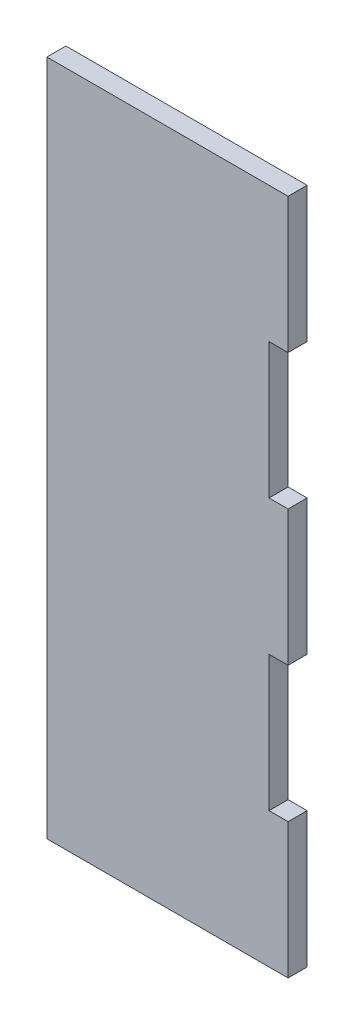
ISO-10303-21;
HEADER;
FILE_DESCRIPTION(('STEP AP214'),'2;1');
FILE_NAME('part.step','',(''),(''),'','','');
FILE_SCHEMA(('AUTOMOTIVE_DESIGN { 1 0 10303 214 1 1 1 1 }'));
ENDSEC;
DATA;
#1=APPLICATION_CONTEXT('core data for automotive mechanical design processes');
#2=APPLICATION_PROTOCOL_DEFINITION('international standard','automotive_design',2000,#1);
#3=PRODUCT_CONTEXT('',#1,'mechanical');
#4=PRODUCT('Part','Part','',(#3));
#5=PRODUCT_RELATED_PRODUCT_CATEGORY('part','',(#4));
#6=PRODUCT_DEFINITION_FORMATION('','',#4);
#7=PRODUCT_DEFINITION_CONTEXT('part definition',#1,'design');
#8=PRODUCT_DEFINITION('design','',#6,#7);
#9=PRODUCT_DEFINITION_SHAPE('','',#8);
#10=(LENGTH_UNIT() NAMED_UNIT(*) SI_UNIT(.MILLI.,.METRE.));
#11=(NAMED_UNIT(*) PLANE_ANGLE_UNIT() SI_UNIT($,.RADIAN.));
#12=(NAMED_UNIT(*) SI_UNIT($,.STERADIAN.) SOLID_ANGLE_UNIT());
#13=UNCERTAINTY_MEASURE_WITH_UNIT(LENGTH_MEASURE(1.E-05),#10,'distance_accuracy_value','');
#14=(GEOMETRIC_REPRESENTATION_CONTEXT(3) GLOBAL_UNCERTAINTY_ASSIGNED_CONTEXT((#13)) GLOBAL_UNIT_ASSIGNED_CONTEXT((#10,
#11,#12)) REPRESENTATION_CONTEXT('',''));
#15=CARTESIAN_POINT('',(0.,0.,0.));
#16=DIRECTION('',(0.,0.,1.));
#17=DIRECTION('',(1.,0.,0.));
#18=AXIS2_PLACEMENT_3D('',#15,#16,#17);
#19=CARTESIAN_POINT('',(0.,0.,9.));
#20=DIRECTION('',(0.,1.,0.));
#21=DIRECTION('',(0.,0.,1.));
#22=AXIS2_PLACEMENT_3D('',#19,#20,#21);
#23=PLANE('',#22);
#24=DIRECTION('',(1.,0.,0.));
#25=VECTOR('',#24,1.);
#26=CARTESIAN_POINT('',(0.,0.,0.));
#27=LINE('',#26,#25);
#28=CARTESIAN_POINT('',(0.,0.,0.));
#29=VERTEX_POINT('',#28);
#30=CARTESIAN_POINT('',(114.,0.,0.));
#31=VERTEX_POINT('',#30);
#32=EDGE_CURVE('E245',#29,#31,#27,.T.);
#33=ORIENTED_EDGE('',*,*,#32,.T.);
#34=DIRECTION('',(0.,0.,-1.));
#35=VECTOR('',#34,1.);
#36=CARTESIAN_POINT('',(114.,0.,9.));
#37=LINE('',#36,#35);
#38=CARTESIAN_POINT('',(114.,0.,9.));
#39=VERTEX_POINT('',#38);
#40=EDGE_CURVE('E12',#39,#31,#37,.T.);
#41=ORIENTED_EDGE('',*,*,#40,.F.);
#42=DIRECTION('',(1.,0.,0.));
#43=VECTOR('',#42,1.);
#44=CARTESIAN_POINT('',(0.,0.,9.));
#45=LINE('',#44,#43);
#46=CARTESIAN_POINT('',(0.,0.,9.));
#47=VERTEX_POINT('',#46);
#48=EDGE_CURVE('E200',#47,#39,#45,.T.);
#49=ORIENTED_EDGE('',*,*,#48,.F.);
#50=DIRECTION('',(0.,0.,-1.));
#51=VECTOR('',#50,1.);
#52=CARTESIAN_POINT('',(0.,0.,9.));
#53=LINE('',#52,#51);
#54=EDGE_CURVE('E162',#47,#29,#53,.T.);
#55=ORIENTED_EDGE('',*,*,#54,.T.);
#56=EDGE_LOOP('',(#33,#41,#49,#55));
#57=FACE_BOUND('',#56,.T.);
#58=ADVANCED_FACE('F46',(#57),#23,.F.);
#59=CARTESIAN_POINT('',(114.,0.,9.));
#60=DIRECTION('',(-1.,0.,0.));
#61=DIRECTION('',(0.,0.,1.));
#62=AXIS2_PLACEMENT_3D('',#59,#60,#61);
#63=PLANE('',#62);
#64=DIRECTION('',(0.,1.,0.));
#65=VECTOR('',#64,1.);
#66=CARTESIAN_POINT('',(114.,0.,0.));
#67=LINE('',#66,#65);
#68=CARTESIAN_POINT('',(114.,64.,0.));
#69=VERTEX_POINT('',#68);
#70=EDGE_CURVE('E239',#31,#69,#67,.T.);
#71=ORIENTED_EDGE('',*,*,#70,.T.);
#72=DIRECTION('',(0.,0.,-1.));
#73=VECTOR('',#72,1.);
#74=CARTESIAN_POINT('',(114.,64.,9.));
#75=LINE('',#74,#73);
#76=CARTESIAN_POINT('',(114.,64.,9.));
#77=VERTEX_POINT('',#76);
#78=EDGE_CURVE('E54',#77,#69,#75,.T.);
#79=ORIENTED_EDGE('',*,*,#78,.F.);
#80=DIRECTION('',(0.,1.,0.));
#81=VECTOR('',#80,1.);
#82=CARTESIAN_POINT('',(114.,0.,9.));
#83=LINE('',#82,#81);
#84=EDGE_CURVE('E117',#39,#77,#83,.T.);
#85=ORIENTED_EDGE('',*,*,#84,.F.);
#86=ORIENTED_EDGE('',*,*,#40,.T.);
#87=EDGE_LOOP('',(#71,#79,#85,#86));
#88=FACE_BOUND('',#87,.T.);
#89=ADVANCED_FACE('F274',(#88),#63,.F.);
#90=CARTESIAN_POINT('',(114.,64.,9.));
#91=DIRECTION('',(0.,-1.,0.));
#92=DIRECTION('',(0.,0.,-1.));
#93=AXIS2_PLACEMENT_3D('',#90,#91,#92);
#94=PLANE('',#93);
#95=DIRECTION('',(-1.,0.,0.));
#96=VECTOR('',#95,1.);
#97=CARTESIAN_POINT('',(114.,64.,0.));
#98=LINE('',#97,#96);
#99=CARTESIAN_POINT('',(105.,64.,0.));
#100=VERTEX_POINT('',#99);
#101=EDGE_CURVE('E234',#69,#100,#98,.T.);
#102=ORIENTED_EDGE('',*,*,#101,.T.);
#103=DIRECTION('',(0.,0.,-1.));
#104=VECTOR('',#103,1.);
#105=CARTESIAN_POINT('',(105.,64.,9.));
#106=LINE('',#105,#104);
#107=CARTESIAN_POINT('',(105.,64.,9.));
#108=VERTEX_POINT('',#107);
#109=EDGE_CURVE('E226',#108,#100,#106,.T.);
#110=ORIENTED_EDGE('',*,*,#109,.F.);
#111=DIRECTION('',(-1.,0.,0.));
#112=VECTOR('',#111,1.);
#113=CARTESIAN_POINT('',(114.,64.,9.));
#114=LINE('',#113,#112);
#115=EDGE_CURVE('E193',#77,#108,#114,.T.);
#116=ORIENTED_EDGE('',*,*,#115,.F.);
#117=ORIENTED_EDGE('',*,*,#78,.T.);
#118=EDGE_LOOP('',(#102,#110,#116,#117));
#119=FACE_BOUND('',#118,.T.);
#120=ADVANCED_FACE('F232',(#119),#94,.F.);
#121=CARTESIAN_POINT('',(105.,128.,9.));
#122=DIRECTION('',(-1.,0.,0.));
#123=DIRECTION('',(0.,0.,1.));
#124=AXIS2_PLACEMENT_3D('',#121,#122,#123);
#125=PLANE('',#124);
#126=DIRECTION('',(0.,1.,0.));
#127=VECTOR('',#126,1.);
#128=CARTESIAN_POINT('',(105.,128.,0.));
#129=LINE('',#128,#127);
#130=CARTESIAN_POINT('',(105.,128.,0.));
#131=VERTEX_POINT('',#130);
#132=EDGE_CURVE('E241',#100,#131,#129,.T.);
#133=ORIENTED_EDGE('',*,*,#132,.T.);
#134=DIRECTION('',(0.,0.,-1.));
#135=VECTOR('',#134,1.);
#136=CARTESIAN_POINT('',(105.,128.,9.));
#137=LINE('',#136,#135);
#138=CARTESIAN_POINT('',(105.,128.,9.));
#139=VERTEX_POINT('',#138);
#140=EDGE_CURVE('E223',#139,#131,#137,.T.);
#141=ORIENTED_EDGE('',*,*,#140,.F.);
#142=DIRECTION('',(0.,1.,0.));
#143=VECTOR('',#142,1.);
#144=CARTESIAN_POINT('',(105.,128.,9.));
#145=LINE('',#144,#143);
#146=EDGE_CURVE('E190',#108,#139,#145,.T.);
#147=ORIENTED_EDGE('',*,*,#146,.F.);
#148=ORIENTED_EDGE('',*,*,#109,.T.);
#149=EDGE_LOOP('',(#133,#141,#147,#148));
#150=FACE_BOUND('',#149,.T.);
#151=ADVANCED_FACE('F282',(#150),#125,.F.);
#152=CARTESIAN_POINT('',(114.,128.,9.));
#153=DIRECTION('',(0.,1.,0.));
#154=DIRECTION('',(0.,0.,1.));
#155=AXIS2_PLACEMENT_3D('',#152,#153,#154);
#156=PLANE('',#155);
#157=DIRECTION('',(1.,0.,0.));
#158=VECTOR('',#157,1.);
#159=CARTESIAN_POINT('',(114.,128.,0.));
#160=LINE('',#159,#158);
#161=CARTESIAN_POINT('',(114.,128.,0.));
#162=VERTEX_POINT('',#161);
#163=EDGE_CURVE('E243',#131,#162,#160,.T.);
#164=ORIENTED_EDGE('',*,*,#163,.T.);
#165=DIRECTION('',(0.,0.,-1.));
#166=VECTOR('',#165,1.);
#167=CARTESIAN_POINT('',(114.,128.,9.));
#168=LINE('',#167,#166);
#169=CARTESIAN_POINT('',(114.,128.,9.));
#170=VERTEX_POINT('',#169);
#171=EDGE_CURVE('E220',#170,#162,#168,.T.);
#172=ORIENTED_EDGE('',*,*,#171,.F.);
#173=DIRECTION('',(1.,0.,0.));
#174=VECTOR('',#173,1.);
#175=CARTESIAN_POINT('',(114.,128.,9.));
#176=LINE('',#175,#174);
#177=EDGE_CURVE('E188',#139,#170,#176,.T.);
#178=ORIENTED_EDGE('',*,*,#177,.F.);
#179=ORIENTED_EDGE('',*,*,#140,.T.);
#180=EDGE_LOOP('',(#164,#172,#178,#179));
#181=FACE_BOUND('',#180,.T.);
#182=ADVANCED_FACE('F287',(#181),#156,.F.);
#183=CARTESIAN_POINT('',(114.,128.,9.));
#184=DIRECTION('',(-1.,0.,0.));
#185=DIRECTION('',(0.,0.,1.));
#186=AXIS2_PLACEMENT_3D('',#183,#184,#185);
#187=PLANE('',#186);
#188=DIRECTION('',(0.,1.,0.));
#189=VECTOR('',#188,1.);
#190=CARTESIAN_POINT('',(114.,128.,0.));
#191=LINE('',#190,#189);
#192=CARTESIAN_POINT('',(114.,192.,0.));
#193=VERTEX_POINT('',#192);
#194=EDGE_CURVE('E249',#162,#193,#191,.T.);
#195=ORIENTED_EDGE('',*,*,#194,.T.);
#196=DIRECTION('',(0.,0.,-1.));
#197=VECTOR('',#196,1.);
#198=CARTESIAN_POINT('',(114.,192.,9.));
#199=LINE('',#198,#197);
#200=CARTESIAN_POINT('',(114.,192.,9.));
#201=VERTEX_POINT('',#200);
#202=EDGE_CURVE('E217',#201,#193,#199,.T.);
#203=ORIENTED_EDGE('',*,*,#202,.F.);
#204=DIRECTION('',(0.,1.,0.));
#205=VECTOR('',#204,1.);
#206=CARTESIAN_POINT('',(114.,128.,9.));
#207=LINE('',#206,#205);
#208=EDGE_CURVE('E180',#170,#201,#207,.T.);
#209=ORIENTED_EDGE('',*,*,#208,.F.);
#210=ORIENTED_EDGE('',*,*,#171,.T.);
#211=EDGE_LOOP('',(#195,#203,#209,#210));
#212=FACE_BOUND('',#211,.T.);
#213=ADVANCED_FACE('F291',(#212),#187,.F.);
#214=CARTESIAN_POINT('',(114.,192.,9.));
#215=DIRECTION('',(0.,-1.,0.));
#216=DIRECTION('',(0.,0.,-1.));
#217=AXIS2_PLACEMENT_3D('',#214,#215,#216);
#218=PLANE('',#217);
#219=DIRECTION('',(-1.,0.,0.));
#220=VECTOR('',#219,1.);
#221=CARTESIAN_POINT('',(114.,192.,0.));
#222=LINE('',#221,#220);
#223=CARTESIAN_POINT('',(105.,192.,0.));
#224=VERTEX_POINT('',#223);
#225=EDGE_CURVE('E251',#193,#224,#222,.T.);
#226=ORIENTED_EDGE('',*,*,#225,.T.);
#227=DIRECTION('',(0.,0.,-1.));
#228=VECTOR('',#227,1.);
#229=CARTESIAN_POINT('',(105.,192.,9.));
#230=LINE('',#229,#228);
#231=CARTESIAN_POINT('',(105.,192.,9.));
#232=VERTEX_POINT('',#231);
#233=EDGE_CURVE('E214',#232,#224,#230,.T.);
#234=ORIENTED_EDGE('',*,*,#233,.F.);
#235=DIRECTION('',(-1.,0.,0.));
#236=VECTOR('',#235,1.);
#237=CARTESIAN_POINT('',(114.,192.,9.));
#238=LINE('',#237,#236);
#239=EDGE_CURVE('E177',#201,#232,#238,.T.);
#240=ORIENTED_EDGE('',*,*,#239,.F.);
#241=ORIENTED_EDGE('',*,*,#202,.T.);
#242=EDGE_LOOP('',(#226,#234,#240,#241));
#243=FACE_BOUND('',#242,.T.);
#244=ADVANCED_FACE('F294',(#243),#218,.F.);
#245=CARTESIAN_POINT('',(105.,256.,9.));
#246=DIRECTION('',(-1.,0.,0.));
#247=DIRECTION('',(0.,0.,1.));
#248=AXIS2_PLACEMENT_3D('',#245,#246,#247);
#249=PLANE('',#248);
#250=DIRECTION('',(0.,1.,0.));
#251=VECTOR('',#250,1.);
#252=CARTESIAN_POINT('',(105.,256.,0.));
#253=LINE('',#252,#251);
#254=CARTESIAN_POINT('',(105.,256.,0.));
#255=VERTEX_POINT('',#254);
#256=EDGE_CURVE('E253',#224,#255,#253,.T.);
#257=ORIENTED_EDGE('',*,*,#256,.T.);
#258=DIRECTION('',(0.,0.,-1.));
#259=VECTOR('',#258,1.);
#260=CARTESIAN_POINT('',(105.,256.,9.));
#261=LINE('',#260,#259);
#262=CARTESIAN_POINT('',(105.,256.,9.));
#263=VERTEX_POINT('',#262);
#264=EDGE_CURVE('E211',#263,#255,#261,.T.);
#265=ORIENTED_EDGE('',*,*,#264,.F.);
#266=DIRECTION('',(0.,1.,0.));
#267=VECTOR('',#266,1.);
#268=CARTESIAN_POINT('',(105.,256.,9.));
#269=LINE('',#268,#267);
#270=EDGE_CURVE('E174',#232,#263,#269,.T.);
#271=ORIENTED_EDGE('',*,*,#270,.F.);
#272=ORIENTED_EDGE('',*,*,#233,.T.);
#273=EDGE_LOOP('',(#257,#265,#271,#272));
#274=FACE_BOUND('',#273,.T.);
#275=ADVANCED_FACE('F298',(#274),#249,.F.);
#276=CARTESIAN_POINT('',(114.,256.,9.));
#277=DIRECTION('',(0.,1.,0.));
#278=DIRECTION('',(0.,0.,1.));
#279=AXIS2_PLACEMENT_3D('',#276,#277,#278);
#280=PLANE('',#279);
#281=DIRECTION('',(1.,0.,0.));
#282=VECTOR('',#281,1.);
#283=CARTESIAN_POINT('',(114.,256.,0.));
#284=LINE('',#283,#282);
#285=CARTESIAN_POINT('',(114.,256.,0.));
#286=VERTEX_POINT('',#285);
#287=EDGE_CURVE('E255',#255,#286,#284,.T.);
#288=ORIENTED_EDGE('',*,*,#287,.T.);
#289=DIRECTION('',(0.,0.,-1.));
#290=VECTOR('',#289,1.);
#291=CARTESIAN_POINT('',(114.,256.,9.));
#292=LINE('',#291,#290);
#293=CARTESIAN_POINT('',(114.,256.,9.));
#294=VERTEX_POINT('',#293);
#295=EDGE_CURVE('E157',#294,#286,#292,.T.);
#296=ORIENTED_EDGE('',*,*,#295,.F.);
#297=DIRECTION('',(1.,0.,0.));
#298=VECTOR('',#297,1.);
#299=CARTESIAN_POINT('',(114.,256.,9.));
#300=LINE('',#299,#298);
#301=EDGE_CURVE('E148',#263,#294,#300,.T.);
#302=ORIENTED_EDGE('',*,*,#301,.F.);
#303=ORIENTED_EDGE('',*,*,#264,.T.);
#304=EDGE_LOOP('',(#288,#296,#302,#303));
#305=FACE_BOUND('',#304,.T.);
#306=ADVANCED_FACE('F258',(#305),#280,.F.);
#307=CARTESIAN_POINT('',(114.,256.,9.));
#308=DIRECTION('',(-1.,0.,0.));
#309=DIRECTION('',(0.,0.,1.));
#310=AXIS2_PLACEMENT_3D('',#307,#308,#309);
#311=PLANE('',#310);
#312=DIRECTION('',(0.,1.,0.));
#313=VECTOR('',#312,1.);
#314=CARTESIAN_POINT('',(114.,256.,0.));
#315=LINE('',#314,#313);
#316=CARTESIAN_POINT('',(114.,320.,0.));
#317=VERTEX_POINT('',#316);
#318=EDGE_CURVE('E156',#286,#317,#315,.T.);
#319=ORIENTED_EDGE('',*,*,#318,.T.);
#320=DIRECTION('',(0.,0.,-1.));
#321=VECTOR('',#320,1.);
#322=CARTESIAN_POINT('',(114.,320.,9.));
#323=LINE('',#322,#321);
#324=CARTESIAN_POINT('',(114.,320.,9.));
#325=VERTEX_POINT('',#324);
#326=EDGE_CURVE('E153',#325,#317,#323,.T.);
#327=ORIENTED_EDGE('',*,*,#326,.F.);
#328=DIRECTION('',(0.,1.,0.));
#329=VECTOR('',#328,1.);
#330=CARTESIAN_POINT('',(114.,256.,9.));
#331=LINE('',#330,#329);
#332=EDGE_CURVE('E142',#294,#325,#331,.T.);
#333=ORIENTED_EDGE('',*,*,#332,.F.);
#334=ORIENTED_EDGE('',*,*,#295,.T.);
#335=EDGE_LOOP('',(#319,#327,#333,#334));
#336=FACE_BOUND('',#335,.T.);
#337=ADVANCED_FACE('F154',(#336),#311,.F.);
#338=CARTESIAN_POINT('',(114.,320.,9.));
#339=DIRECTION('',(0.,-1.,0.));
#340=DIRECTION('',(0.,0.,-1.));
#341=AXIS2_PLACEMENT_3D('',#338,#339,#340);
#342=PLANE('',#341);
#343=DIRECTION('',(-1.,0.,0.));
#344=VECTOR('',#343,1.);
#345=CARTESIAN_POINT('',(114.,320.,0.));
#346=LINE('',#345,#344);
#347=CARTESIAN_POINT('',(0.,320.,0.));
#348=VERTEX_POINT('',#347);
#349=EDGE_CURVE('E103',#317,#348,#346,.T.);
#350=ORIENTED_EDGE('',*,*,#349,.T.);
#351=DIRECTION('',(0.,0.,-1.));
#352=VECTOR('',#351,1.);
#353=CARTESIAN_POINT('',(0.,320.,9.));
#354=LINE('',#353,#352);
#355=CARTESIAN_POINT('',(0.,320.,9.));
#356=VERTEX_POINT('',#355);
#357=EDGE_CURVE('E158',#356,#348,#354,.T.);
#358=ORIENTED_EDGE('',*,*,#357,.F.);
#359=DIRECTION('',(-1.,0.,0.));
#360=VECTOR('',#359,1.);
#361=CARTESIAN_POINT('',(114.,320.,9.));
#362=LINE('',#361,#360);
#363=EDGE_CURVE('E146',#325,#356,#362,.T.);
#364=ORIENTED_EDGE('',*,*,#363,.F.);
#365=ORIENTED_EDGE('',*,*,#326,.T.);
#366=EDGE_LOOP('',(#350,#358,#364,#365));
#367=FACE_BOUND('',#366,.T.);
#368=ADVANCED_FACE('F160',(#367),#342,.F.);
#369=CARTESIAN_POINT('',(0.,320.,9.));
#370=DIRECTION('',(1.,0.,0.));
#371=DIRECTION('',(0.,1.,0.));
#372=AXIS2_PLACEMENT_3D('',#369,#370,#371);
#373=PLANE('',#372);
#374=DIRECTION('',(0.,-1.,0.));
#375=VECTOR('',#374,1.);
#376=CARTESIAN_POINT('',(0.,320.,0.));
#377=LINE('',#376,#375);
#378=EDGE_CURVE('E109',#348,#29,#377,.T.);
#379=ORIENTED_EDGE('',*,*,#378,.T.);
#380=ORIENTED_EDGE('',*,*,#54,.F.);
#381=DIRECTION('',(0.,-1.,0.));
#382=VECTOR('',#381,1.);
#383=CARTESIAN_POINT('',(0.,320.,9.));
#384=LINE('',#383,#382);
#385=EDGE_CURVE('E62',#356,#47,#384,.T.);
#386=ORIENTED_EDGE('',*,*,#385,.F.);
#387=ORIENTED_EDGE('',*,*,#357,.T.);
#388=EDGE_LOOP('',(#379,#380,#386,#387));
#389=FACE_BOUND('',#388,.T.);
#390=ADVANCED_FACE('F263',(#389),#373,.F.);
#391=CARTESIAN_POINT('',(0.,0.,9.));
#392=DIRECTION('',(0.,0.,1.));
#393=DIRECTION('',(1.,0.,0.));
#394=AXIS2_PLACEMENT_3D('',#391,#392,#393);
#395=PLANE('',#394);
#396=ORIENTED_EDGE('',*,*,#48,.T.);
#397=ORIENTED_EDGE('',*,*,#84,.T.);
#398=ORIENTED_EDGE('',*,*,#115,.T.);
#399=ORIENTED_EDGE('',*,*,#146,.T.);
#400=ORIENTED_EDGE('',*,*,#177,.T.);
#401=ORIENTED_EDGE('',*,*,#208,.T.);
#402=ORIENTED_EDGE('',*,*,#239,.T.);
#403=ORIENTED_EDGE('',*,*,#270,.T.);
#404=ORIENTED_EDGE('',*,*,#301,.T.);
#405=ORIENTED_EDGE('',*,*,#332,.T.);
#406=ORIENTED_EDGE('',*,*,#363,.T.);
#407=ORIENTED_EDGE('',*,*,#385,.T.);
#408=EDGE_LOOP('',(#396,#397,#398,#399,#400,#401,#402,#403,#404,#405,#406,#407));
#409=FACE_BOUND('',#408,.T.);
#410=ADVANCED_FACE('F144',(#409),#395,.T.);
#411=CARTESIAN_POINT('',(0.,0.,0.));
#412=DIRECTION('',(0.,0.,1.));
#413=DIRECTION('',(1.,0.,0.));
#414=AXIS2_PLACEMENT_3D('',#411,#412,#413);
#415=PLANE('',#414);
#416=ORIENTED_EDGE('',*,*,#32,.F.);
#417=ORIENTED_EDGE('',*,*,#378,.F.);
#418=ORIENTED_EDGE('',*,*,#349,.F.);
#419=ORIENTED_EDGE('',*,*,#318,.F.);
#420=ORIENTED_EDGE('',*,*,#287,.F.);
#421=ORIENTED_EDGE('',*,*,#256,.F.);
#422=ORIENTED_EDGE('',*,*,#225,.F.);
#423=ORIENTED_EDGE('',*,*,#194,.F.);
#424=ORIENTED_EDGE('',*,*,#163,.F.);
#425=ORIENTED_EDGE('',*,*,#132,.F.);
#426=ORIENTED_EDGE('',*,*,#101,.F.);
#427=ORIENTED_EDGE('',*,*,#70,.F.);
#428=EDGE_LOOP('',(#416,#417,#418,#419,#420,#421,#422,#423,#424,#425,#426,#427));
#429=FACE_BOUND('',#428,.T.);
#430=ADVANCED_FACE('F238',(#429),#415,.F.);
#431=CLOSED_SHELL('',(#58,#89,#120,#151,#182,#213,#244,#275,#306,#337,#368,#390,#410,#430));
#432=MANIFOLD_SOLID_BREP('B2',#431);
#433=ADVANCED_BREP_SHAPE_REPRESENTATION('',(#18,#432),#14);
#434=SHAPE_DEFINITION_REPRESENTATION(#9,#433);
ENDSEC;
END-ISO-10303-21;
